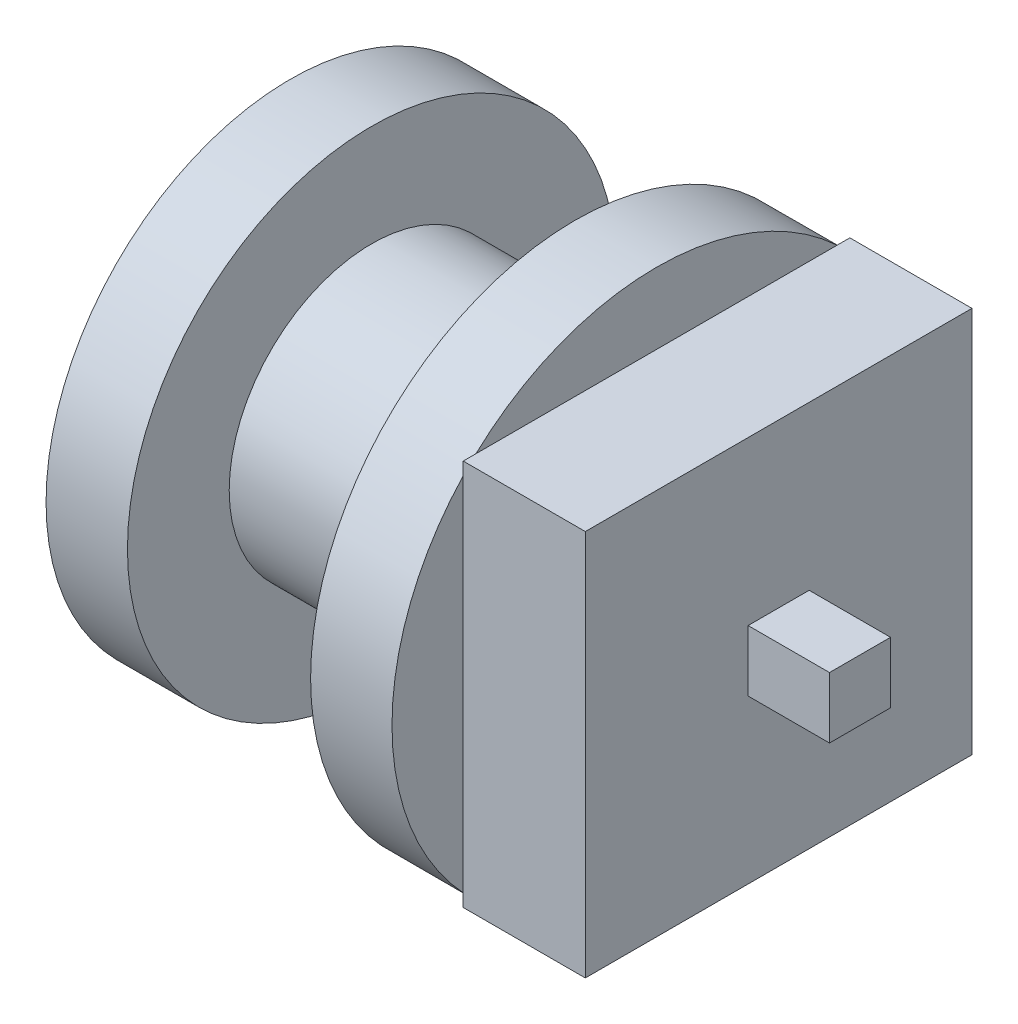
ISO-10303-21;
HEADER;
FILE_DESCRIPTION(('STEP AP214'),'2;1');
FILE_NAME('part.step','',(''),(''),'','','');
FILE_SCHEMA(('AUTOMOTIVE_DESIGN { 1 0 10303 214 1 1 1 1 }'));
ENDSEC;
DATA;
#1=APPLICATION_CONTEXT('core data for automotive mechanical design processes');
#2=APPLICATION_PROTOCOL_DEFINITION('international standard','automotive_design',2000,#1);
#3=PRODUCT_CONTEXT('',#1,'mechanical');
#4=PRODUCT('Part','Part','',(#3));
#5=PRODUCT_RELATED_PRODUCT_CATEGORY('part','',(#4));
#6=PRODUCT_DEFINITION_FORMATION('','',#4);
#7=PRODUCT_DEFINITION_CONTEXT('part definition',#1,'design');
#8=PRODUCT_DEFINITION('design','',#6,#7);
#9=PRODUCT_DEFINITION_SHAPE('','',#8);
#10=(LENGTH_UNIT() NAMED_UNIT(*) SI_UNIT(.MILLI.,.METRE.));
#11=(NAMED_UNIT(*) PLANE_ANGLE_UNIT() SI_UNIT($,.RADIAN.));
#12=(NAMED_UNIT(*) SI_UNIT($,.STERADIAN.) SOLID_ANGLE_UNIT());
#13=UNCERTAINTY_MEASURE_WITH_UNIT(LENGTH_MEASURE(1.E-05),#10,'distance_accuracy_value','');
#14=(GEOMETRIC_REPRESENTATION_CONTEXT(3) GLOBAL_UNCERTAINTY_ASSIGNED_CONTEXT((#13)) GLOBAL_UNIT_ASSIGNED_CONTEXT((#10,
#11,#12)) REPRESENTATION_CONTEXT('',''));
#15=CARTESIAN_POINT('',(0.,0.,0.));
#16=DIRECTION('',(0.,0.,1.));
#17=DIRECTION('',(1.,0.,0.));
#18=AXIS2_PLACEMENT_3D('',#15,#16,#17);
#19=CARTESIAN_POINT('',(-6.,0.,0.));
#20=DIRECTION('',(-1.,0.,0.));
#21=DIRECTION('',(0.,0.,1.));
#22=AXIS2_PLACEMENT_3D('',#19,#20,#21);
#23=PLANE('',#22);
#24=CARTESIAN_POINT('',(-6.,0.,0.));
#25=DIRECTION('',(-1.,0.,0.));
#26=DIRECTION('',(0.,0.,1.));
#27=AXIS2_PLACEMENT_3D('',#24,#25,#26);
#28=CIRCLE('',#27,13.);
#29=CARTESIAN_POINT('',(-6.,8.87411967464943,9.5));
#30=VERTEX_POINT('',#29);
#31=CARTESIAN_POINT('',(-6.,9.5,8.87411967464943));
#32=VERTEX_POINT('',#31);
#33=EDGE_CURVE('E157',#30,#32,#28,.T.);
#34=ORIENTED_EDGE('',*,*,#33,.F.);
#35=DIRECTION('',(0.,1.,0.));
#36=VECTOR('',#35,1.);
#37=CARTESIAN_POINT('',(-6.,9.5,9.5));
#38=LINE('',#37,#36);
#39=CARTESIAN_POINT('',(-6.,9.5,9.5));
#40=VERTEX_POINT('',#39);
#41=EDGE_CURVE('E141',#30,#40,#38,.T.);
#42=ORIENTED_EDGE('',*,*,#41,.T.);
#43=DIRECTION('',(0.,0.,-1.));
#44=VECTOR('',#43,1.);
#45=CARTESIAN_POINT('',(-6.,9.5,-9.5));
#46=LINE('',#45,#44);
#47=EDGE_CURVE('E192',#40,#32,#46,.T.);
#48=ORIENTED_EDGE('',*,*,#47,.T.);
#49=EDGE_LOOP('',(#34,#42,#48));
#50=FACE_BOUND('',#49,.T.);
#51=ADVANCED_FACE('F41',(#50),#23,.T.);
#52=CARTESIAN_POINT('',(-6.,9.5,-8.87411967464943));
#53=VERTEX_POINT('',#52);
#54=CARTESIAN_POINT('',(-6.,8.87411967464942,-9.5));
#55=VERTEX_POINT('',#54);
#56=EDGE_CURVE('E50',#53,#55,#28,.T.);
#57=ORIENTED_EDGE('',*,*,#56,.F.);
#58=CARTESIAN_POINT('',(-6.,9.5,-9.5));
#59=VERTEX_POINT('',#58);
#60=EDGE_CURVE('E138',#53,#59,#46,.T.);
#61=ORIENTED_EDGE('',*,*,#60,.T.);
#62=DIRECTION('',(0.,-1.,0.));
#63=VECTOR('',#62,1.);
#64=CARTESIAN_POINT('',(-6.,9.5,-9.5));
#65=LINE('',#64,#63);
#66=EDGE_CURVE('E182',#59,#55,#65,.T.);
#67=ORIENTED_EDGE('',*,*,#66,.T.);
#68=EDGE_LOOP('',(#57,#61,#67));
#69=FACE_BOUND('',#68,.T.);
#70=ADVANCED_FACE('F179',(#69),#23,.T.);
#71=CARTESIAN_POINT('',(-6.,-8.87411967464943,-9.5));
#72=VERTEX_POINT('',#71);
#73=CARTESIAN_POINT('',(-6.,-9.5,-8.87411967464942));
#74=VERTEX_POINT('',#73);
#75=EDGE_CURVE('E162',#72,#74,#28,.T.);
#76=ORIENTED_EDGE('',*,*,#75,.F.);
#77=CARTESIAN_POINT('',(-6.,-9.5,-9.5));
#78=VERTEX_POINT('',#77);
#79=EDGE_CURVE('E195',#72,#78,#65,.T.);
#80=ORIENTED_EDGE('',*,*,#79,.T.);
#81=DIRECTION('',(0.,0.,1.));
#82=VECTOR('',#81,1.);
#83=CARTESIAN_POINT('',(-6.,-9.5,-9.5));
#84=LINE('',#83,#82);
#85=EDGE_CURVE('E199',#78,#74,#84,.T.);
#86=ORIENTED_EDGE('',*,*,#85,.T.);
#87=EDGE_LOOP('',(#76,#80,#86));
#88=FACE_BOUND('',#87,.T.);
#89=ADVANCED_FACE('F279',(#88),#23,.T.);
#90=CARTESIAN_POINT('',(4.,1.5,-1.5));
#91=DIRECTION('',(0.,0.,1.));
#92=DIRECTION('',(0.,-1.,0.));
#93=AXIS2_PLACEMENT_3D('',#90,#91,#92);
#94=PLANE('',#93);
#95=DIRECTION('',(0.,1.,0.));
#96=VECTOR('',#95,1.);
#97=CARTESIAN_POINT('',(0.,1.5,-1.5));
#98=LINE('',#97,#96);
#99=CARTESIAN_POINT('',(0.,-1.5,-1.5));
#100=VERTEX_POINT('',#99);
#101=CARTESIAN_POINT('',(0.,1.5,-1.5));
#102=VERTEX_POINT('',#101);
#103=EDGE_CURVE('E217',#100,#102,#98,.T.);
#104=ORIENTED_EDGE('',*,*,#103,.T.);
#105=DIRECTION('',(-1.,0.,0.));
#106=VECTOR('',#105,1.);
#107=CARTESIAN_POINT('',(4.,1.5,-1.5));
#108=LINE('',#107,#106);
#109=CARTESIAN_POINT('',(4.,1.5,-1.5));
#110=VERTEX_POINT('',#109);
#111=EDGE_CURVE('E45',#110,#102,#108,.T.);
#112=ORIENTED_EDGE('',*,*,#111,.F.);
#113=DIRECTION('',(0.,1.,0.));
#114=VECTOR('',#113,1.);
#115=CARTESIAN_POINT('',(4.,1.5,-1.5));
#116=LINE('',#115,#114);
#117=CARTESIAN_POINT('',(4.,-1.5,-1.5));
#118=VERTEX_POINT('',#117);
#119=EDGE_CURVE('E218',#118,#110,#116,.T.);
#120=ORIENTED_EDGE('',*,*,#119,.F.);
#121=DIRECTION('',(-1.,0.,0.));
#122=VECTOR('',#121,1.);
#123=CARTESIAN_POINT('',(4.,-1.5,-1.5));
#124=LINE('',#123,#122);
#125=EDGE_CURVE('E228',#118,#100,#124,.T.);
#126=ORIENTED_EDGE('',*,*,#125,.T.);
#127=EDGE_LOOP('',(#104,#112,#120,#126));
#128=FACE_BOUND('',#127,.T.);
#129=ADVANCED_FACE('F43',(#128),#94,.F.);
#130=CARTESIAN_POINT('',(4.,1.5,1.5));
#131=DIRECTION('',(0.,-1.,0.));
#132=DIRECTION('',(0.,0.,-1.));
#133=AXIS2_PLACEMENT_3D('',#130,#131,#132);
#134=PLANE('',#133);
#135=DIRECTION('',(0.,0.,1.));
#136=VECTOR('',#135,1.);
#137=CARTESIAN_POINT('',(0.,1.5,1.5));
#138=LINE('',#137,#136);
#139=CARTESIAN_POINT('',(0.,1.5,1.5));
#140=VERTEX_POINT('',#139);
#141=EDGE_CURVE('E231',#102,#140,#138,.T.);
#142=ORIENTED_EDGE('',*,*,#141,.T.);
#143=DIRECTION('',(-1.,0.,0.));
#144=VECTOR('',#143,1.);
#145=CARTESIAN_POINT('',(4.,1.5,1.5));
#146=LINE('',#145,#144);
#147=CARTESIAN_POINT('',(4.,1.5,1.5));
#148=VERTEX_POINT('',#147);
#149=EDGE_CURVE('E164',#148,#140,#146,.T.);
#150=ORIENTED_EDGE('',*,*,#149,.F.);
#151=DIRECTION('',(0.,0.,1.));
#152=VECTOR('',#151,1.);
#153=CARTESIAN_POINT('',(4.,1.5,1.5));
#154=LINE('',#153,#152);
#155=EDGE_CURVE('E221',#110,#148,#154,.T.);
#156=ORIENTED_EDGE('',*,*,#155,.F.);
#157=ORIENTED_EDGE('',*,*,#111,.T.);
#158=EDGE_LOOP('',(#142,#150,#156,#157));
#159=FACE_BOUND('',#158,.T.);
#160=ADVANCED_FACE('F250',(#159),#134,.F.);
#161=CARTESIAN_POINT('',(4.,1.5,1.5));
#162=DIRECTION('',(0.,0.,-1.));
#163=DIRECTION('',(0.,1.,0.));
#164=AXIS2_PLACEMENT_3D('',#161,#162,#163);
#165=PLANE('',#164);
#166=DIRECTION('',(0.,-1.,0.));
#167=VECTOR('',#166,1.);
#168=CARTESIAN_POINT('',(0.,1.5,1.5));
#169=LINE('',#168,#167);
#170=CARTESIAN_POINT('',(0.,-1.5,1.5));
#171=VERTEX_POINT('',#170);
#172=EDGE_CURVE('E234',#140,#171,#169,.T.);
#173=ORIENTED_EDGE('',*,*,#172,.T.);
#174=DIRECTION('',(-1.,0.,0.));
#175=VECTOR('',#174,1.);
#176=CARTESIAN_POINT('',(4.,-1.5,1.5));
#177=LINE('',#176,#175);
#178=CARTESIAN_POINT('',(4.,-1.5,1.5));
#179=VERTEX_POINT('',#178);
#180=EDGE_CURVE('E241',#179,#171,#177,.T.);
#181=ORIENTED_EDGE('',*,*,#180,.F.);
#182=DIRECTION('',(0.,-1.,0.));
#183=VECTOR('',#182,1.);
#184=CARTESIAN_POINT('',(4.,1.5,1.5));
#185=LINE('',#184,#183);
#186=EDGE_CURVE('E224',#148,#179,#185,.T.);
#187=ORIENTED_EDGE('',*,*,#186,.F.);
#188=ORIENTED_EDGE('',*,*,#149,.T.);
#189=EDGE_LOOP('',(#173,#181,#187,#188));
#190=FACE_BOUND('',#189,.T.);
#191=ADVANCED_FACE('F247',(#190),#165,.F.);
#192=CARTESIAN_POINT('',(4.,-1.5,1.5));
#193=DIRECTION('',(0.,1.,0.));
#194=DIRECTION('',(0.,0.,1.));
#195=AXIS2_PLACEMENT_3D('',#192,#193,#194);
#196=PLANE('',#195);
#197=DIRECTION('',(0.,0.,-1.));
#198=VECTOR('',#197,1.);
#199=CARTESIAN_POINT('',(0.,-1.5,1.5));
#200=LINE('',#199,#198);
#201=EDGE_CURVE('E222',#171,#100,#200,.T.);
#202=ORIENTED_EDGE('',*,*,#201,.T.);
#203=ORIENTED_EDGE('',*,*,#125,.F.);
#204=DIRECTION('',(0.,0.,-1.));
#205=VECTOR('',#204,1.);
#206=CARTESIAN_POINT('',(4.,-1.5,1.5));
#207=LINE('',#206,#205);
#208=EDGE_CURVE('E226',#179,#118,#207,.T.);
#209=ORIENTED_EDGE('',*,*,#208,.F.);
#210=ORIENTED_EDGE('',*,*,#180,.T.);
#211=EDGE_LOOP('',(#202,#203,#209,#210));
#212=FACE_BOUND('',#211,.T.);
#213=ADVANCED_FACE('F257',(#212),#196,.F.);
#214=CARTESIAN_POINT('',(4.,0.,0.));
#215=DIRECTION('',(1.,0.,0.));
#216=DIRECTION('',(0.,0.,-1.));
#217=AXIS2_PLACEMENT_3D('',#214,#215,#216);
#218=PLANE('',#217);
#219=ORIENTED_EDGE('',*,*,#119,.T.);
#220=ORIENTED_EDGE('',*,*,#155,.T.);
#221=ORIENTED_EDGE('',*,*,#186,.T.);
#222=ORIENTED_EDGE('',*,*,#208,.T.);
#223=EDGE_LOOP('',(#219,#220,#221,#222));
#224=FACE_BOUND('',#223,.T.);
#225=ADVANCED_FACE('F262',(#224),#218,.T.);
#226=CARTESIAN_POINT('',(-6.,9.5,9.5));
#227=DIRECTION('',(0.,0.,-1.));
#228=DIRECTION('',(0.,1.,0.));
#229=AXIS2_PLACEMENT_3D('',#226,#227,#228);
#230=PLANE('',#229);
#231=DIRECTION('',(0.,1.,0.));
#232=VECTOR('',#231,1.);
#233=CARTESIAN_POINT('',(0.,9.5,9.5));
#234=LINE('',#233,#232);
#235=CARTESIAN_POINT('',(0.,-9.5,9.5));
#236=VERTEX_POINT('',#235);
#237=CARTESIAN_POINT('',(0.,9.5,9.5));
#238=VERTEX_POINT('',#237);
#239=EDGE_CURVE('E170',#236,#238,#234,.T.);
#240=ORIENTED_EDGE('',*,*,#239,.T.);
#241=DIRECTION('',(1.,0.,0.));
#242=VECTOR('',#241,1.);
#243=CARTESIAN_POINT('',(-6.,9.5,9.5));
#244=LINE('',#243,#242);
#245=EDGE_CURVE('E214',#40,#238,#244,.T.);
#246=ORIENTED_EDGE('',*,*,#245,.F.);
#247=ORIENTED_EDGE('',*,*,#41,.F.);
#248=CARTESIAN_POINT('',(-6.,-8.87411967464943,9.5));
#249=VERTEX_POINT('',#248);
#250=EDGE_CURVE('E139',#249,#30,#38,.T.);
#251=ORIENTED_EDGE('',*,*,#250,.F.);
#252=CARTESIAN_POINT('',(-6.,-9.5,9.5));
#253=VERTEX_POINT('',#252);
#254=EDGE_CURVE('E131',#253,#249,#38,.T.);
#255=ORIENTED_EDGE('',*,*,#254,.F.);
#256=DIRECTION('',(1.,0.,0.));
#257=VECTOR('',#256,1.);
#258=CARTESIAN_POINT('',(-6.,-9.5,9.5));
#259=LINE('',#258,#257);
#260=EDGE_CURVE('E201',#253,#236,#259,.T.);
#261=ORIENTED_EDGE('',*,*,#260,.T.);
#262=EDGE_LOOP('',(#240,#246,#247,#251,#255,#261));
#263=FACE_BOUND('',#262,.T.);
#264=ADVANCED_FACE('F146',(#263),#230,.F.);
#265=CARTESIAN_POINT('',(-6.,9.5,-9.5));
#266=DIRECTION('',(0.,-1.,0.));
#267=DIRECTION('',(0.,0.,-1.));
#268=AXIS2_PLACEMENT_3D('',#265,#266,#267);
#269=PLANE('',#268);
#270=DIRECTION('',(0.,0.,-1.));
#271=VECTOR('',#270,1.);
#272=CARTESIAN_POINT('',(0.,9.5,-9.5));
#273=LINE('',#272,#271);
#274=CARTESIAN_POINT('',(0.,9.5,-9.5));
#275=VERTEX_POINT('',#274);
#276=EDGE_CURVE('E203',#238,#275,#273,.T.);
#277=ORIENTED_EDGE('',*,*,#276,.T.);
#278=DIRECTION('',(1.,0.,0.));
#279=VECTOR('',#278,1.);
#280=CARTESIAN_POINT('',(-6.,9.5,-9.5));
#281=LINE('',#280,#279);
#282=EDGE_CURVE('E190',#59,#275,#281,.T.);
#283=ORIENTED_EDGE('',*,*,#282,.F.);
#284=ORIENTED_EDGE('',*,*,#60,.F.);
#285=EDGE_CURVE('E187',#32,#53,#46,.T.);
#286=ORIENTED_EDGE('',*,*,#285,.F.);
#287=ORIENTED_EDGE('',*,*,#47,.F.);
#288=ORIENTED_EDGE('',*,*,#245,.T.);
#289=EDGE_LOOP('',(#277,#283,#284,#286,#287,#288));
#290=FACE_BOUND('',#289,.T.);
#291=ADVANCED_FACE('F185',(#290),#269,.F.);
#292=CARTESIAN_POINT('',(-6.,9.5,-9.5));
#293=DIRECTION('',(0.,0.,1.));
#294=DIRECTION('',(0.,-1.,0.));
#295=AXIS2_PLACEMENT_3D('',#292,#293,#294);
#296=PLANE('',#295);
#297=DIRECTION('',(0.,-1.,0.));
#298=VECTOR('',#297,1.);
#299=CARTESIAN_POINT('',(0.,9.5,-9.5));
#300=LINE('',#299,#298);
#301=CARTESIAN_POINT('',(0.,-9.5,-9.5));
#302=VERTEX_POINT('',#301);
#303=EDGE_CURVE('E205',#275,#302,#300,.T.);
#304=ORIENTED_EDGE('',*,*,#303,.T.);
#305=DIRECTION('',(1.,0.,0.));
#306=VECTOR('',#305,1.);
#307=CARTESIAN_POINT('',(-6.,-9.5,-9.5));
#308=LINE('',#307,#306);
#309=EDGE_CURVE('E210',#78,#302,#308,.T.);
#310=ORIENTED_EDGE('',*,*,#309,.F.);
#311=ORIENTED_EDGE('',*,*,#79,.F.);
#312=EDGE_CURVE('E198',#55,#72,#65,.T.);
#313=ORIENTED_EDGE('',*,*,#312,.F.);
#314=ORIENTED_EDGE('',*,*,#66,.F.);
#315=ORIENTED_EDGE('',*,*,#282,.T.);
#316=EDGE_LOOP('',(#304,#310,#311,#313,#314,#315));
#317=FACE_BOUND('',#316,.T.);
#318=ADVANCED_FACE('F288',(#317),#296,.F.);
#319=CARTESIAN_POINT('',(-6.,-9.5,-9.5));
#320=DIRECTION('',(0.,1.,0.));
#321=DIRECTION('',(0.,0.,1.));
#322=AXIS2_PLACEMENT_3D('',#319,#320,#321);
#323=PLANE('',#322);
#324=DIRECTION('',(0.,0.,1.));
#325=VECTOR('',#324,1.);
#326=CARTESIAN_POINT('',(0.,-9.5,-9.5));
#327=LINE('',#326,#325);
#328=EDGE_CURVE('E207',#302,#236,#327,.T.);
#329=ORIENTED_EDGE('',*,*,#328,.T.);
#330=ORIENTED_EDGE('',*,*,#260,.F.);
#331=CARTESIAN_POINT('',(-6.,-9.5,8.87411967464942));
#332=VERTEX_POINT('',#331);
#333=EDGE_CURVE('E134',#332,#253,#84,.T.);
#334=ORIENTED_EDGE('',*,*,#333,.F.);
#335=EDGE_CURVE('E65',#74,#332,#84,.T.);
#336=ORIENTED_EDGE('',*,*,#335,.F.);
#337=ORIENTED_EDGE('',*,*,#85,.F.);
#338=ORIENTED_EDGE('',*,*,#309,.T.);
#339=EDGE_LOOP('',(#329,#330,#334,#336,#337,#338));
#340=FACE_BOUND('',#339,.T.);
#341=ADVANCED_FACE('F283',(#340),#323,.F.);
#342=EDGE_CURVE('E58',#332,#249,#28,.T.);
#343=ORIENTED_EDGE('',*,*,#342,.F.);
#344=ORIENTED_EDGE('',*,*,#333,.T.);
#345=ORIENTED_EDGE('',*,*,#254,.T.);
#346=EDGE_LOOP('',(#343,#344,#345));
#347=FACE_BOUND('',#346,.T.);
#348=ADVANCED_FACE('F133',(#347),#23,.T.);
#349=CARTESIAN_POINT('',(0.,0.,0.));
#350=DIRECTION('',(-1.,0.,0.));
#351=DIRECTION('',(0.,0.,1.));
#352=AXIS2_PLACEMENT_3D('',#349,#350,#351);
#353=PLANE('',#352);
#354=ORIENTED_EDGE('',*,*,#103,.F.);
#355=ORIENTED_EDGE('',*,*,#201,.F.);
#356=ORIENTED_EDGE('',*,*,#172,.F.);
#357=ORIENTED_EDGE('',*,*,#141,.F.);
#358=EDGE_LOOP('',(#354,#355,#356,#357));
#359=FACE_BOUND('',#358,.T.);
#360=ORIENTED_EDGE('',*,*,#239,.F.);
#361=ORIENTED_EDGE('',*,*,#328,.F.);
#362=ORIENTED_EDGE('',*,*,#303,.F.);
#363=ORIENTED_EDGE('',*,*,#276,.F.);
#364=EDGE_LOOP('',(#360,#361,#362,#363));
#365=FACE_BOUND('',#364,.T.);
#366=ADVANCED_FACE('F253',(#359,#365),#353,.F.);
#367=CARTESIAN_POINT('',(-6.,0.,0.));
#368=DIRECTION('',(-1.,0.,0.));
#369=DIRECTION('',(0.,0.,1.));
#370=AXIS2_PLACEMENT_3D('',#367,#368,#369);
#371=PLANE('',#370);
#372=EDGE_CURVE('E150',#249,#30,#28,.T.);
#373=ORIENTED_EDGE('',*,*,#372,.F.);
#374=ORIENTED_EDGE('',*,*,#250,.T.);
#375=EDGE_LOOP('',(#373,#374));
#376=FACE_BOUND('',#375,.T.);
#377=ADVANCED_FACE('F151',(#376),#371,.F.);
#378=EDGE_CURVE('E167',#32,#53,#28,.T.);
#379=ORIENTED_EDGE('',*,*,#378,.F.);
#380=ORIENTED_EDGE('',*,*,#285,.T.);
#381=EDGE_LOOP('',(#379,#380));
#382=FACE_BOUND('',#381,.T.);
#383=ADVANCED_FACE('F194',(#382),#371,.F.);
#384=EDGE_CURVE('E171',#55,#72,#28,.T.);
#385=ORIENTED_EDGE('',*,*,#384,.F.);
#386=ORIENTED_EDGE('',*,*,#312,.T.);
#387=EDGE_LOOP('',(#385,#386));
#388=FACE_BOUND('',#387,.T.);
#389=ADVANCED_FACE('F299',(#388),#371,.F.);
#390=EDGE_CURVE('E154',#74,#332,#28,.T.);
#391=ORIENTED_EDGE('',*,*,#390,.F.);
#392=ORIENTED_EDGE('',*,*,#335,.T.);
#393=EDGE_LOOP('',(#391,#392));
#394=FACE_BOUND('',#393,.T.);
#395=ADVANCED_FACE('F301',(#394),#371,.F.);
#396=CARTESIAN_POINT('',(-10.,0.,0.));
#397=DIRECTION('',(1.,0.,0.));
#398=DIRECTION('',(0.,0.,-1.));
#399=AXIS2_PLACEMENT_3D('',#396,#397,#398);
#400=CYLINDRICAL_SURFACE('',#399,13.);
#401=CARTESIAN_POINT('',(-10.,0.,0.));
#402=DIRECTION('',(-1.,0.,0.));
#403=DIRECTION('',(0.,0.,1.));
#404=AXIS2_PLACEMENT_3D('',#401,#402,#403);
#405=CIRCLE('',#404,13.);
#406=CARTESIAN_POINT('',(-10.,0.,13.));
#407=VERTEX_POINT('',#406);
#408=EDGE_CURVE('E166',#407,#407,#405,.T.);
#409=ORIENTED_EDGE('',*,*,#408,.F.);
#410=EDGE_LOOP('',(#409));
#411=FACE_BOUND('',#410,.T.);
#412=ORIENTED_EDGE('',*,*,#33,.T.);
#413=ORIENTED_EDGE('',*,*,#378,.T.);
#414=ORIENTED_EDGE('',*,*,#56,.T.);
#415=ORIENTED_EDGE('',*,*,#384,.T.);
#416=ORIENTED_EDGE('',*,*,#75,.T.);
#417=ORIENTED_EDGE('',*,*,#390,.T.);
#418=ORIENTED_EDGE('',*,*,#342,.T.);
#419=ORIENTED_EDGE('',*,*,#372,.T.);
#420=EDGE_LOOP('',(#412,#413,#414,#415,#416,#417,#418,#419));
#421=FACE_BOUND('',#420,.T.);
#422=ADVANCED_FACE('F159',(#411,#421),#400,.T.);
#423=CARTESIAN_POINT('',(-10.,0.,0.));
#424=DIRECTION('',(-1.,0.,0.));
#425=DIRECTION('',(0.,0.,1.));
#426=AXIS2_PLACEMENT_3D('',#423,#424,#425);
#427=PLANE('',#426);
#428=CARTESIAN_POINT('',(-10.,0.,0.));
#429=DIRECTION('',(-1.,0.,0.));
#430=DIRECTION('',(0.,0.,1.));
#431=AXIS2_PLACEMENT_3D('',#428,#429,#430);
#432=CIRCLE('',#431,7.);
#433=CARTESIAN_POINT('',(-10.,0.,7.));
#434=VERTEX_POINT('',#433);
#435=EDGE_CURVE('E11',#434,#434,#432,.T.);
#436=ORIENTED_EDGE('',*,*,#435,.F.);
#437=EDGE_LOOP('',(#436));
#438=FACE_BOUND('',#437,.T.);
#439=ORIENTED_EDGE('',*,*,#408,.T.);
#440=EDGE_LOOP('',(#439));
#441=FACE_BOUND('',#440,.T.);
#442=ADVANCED_FACE('F309',(#438,#441),#427,.T.);
#443=CARTESIAN_POINT('',(-20.,0.,0.));
#444=DIRECTION('',(1.,0.,0.));
#445=DIRECTION('',(0.,0.,-1.));
#446=AXIS2_PLACEMENT_3D('',#443,#444,#445);
#447=CYLINDRICAL_SURFACE('',#446,7.);
#448=CARTESIAN_POINT('',(-20.,0.,0.));
#449=DIRECTION('',(-1.,0.,0.));
#450=DIRECTION('',(0.,0.,1.));
#451=AXIS2_PLACEMENT_3D('',#448,#449,#450);
#452=CIRCLE('',#451,7.);
#453=CARTESIAN_POINT('',(-20.,0.,7.));
#454=VERTEX_POINT('',#453);
#455=EDGE_CURVE('E155',#454,#454,#452,.T.);
#456=ORIENTED_EDGE('',*,*,#455,.F.);
#457=EDGE_LOOP('',(#456));
#458=FACE_BOUND('',#457,.T.);
#459=ORIENTED_EDGE('',*,*,#435,.T.);
#460=EDGE_LOOP('',(#459));
#461=FACE_BOUND('',#460,.T.);
#462=ADVANCED_FACE('F316',(#458,#461),#447,.T.);
#463=CARTESIAN_POINT('',(-24.,0.,0.));
#464=DIRECTION('',(1.,0.,0.));
#465=DIRECTION('',(0.,0.,-1.));
#466=AXIS2_PLACEMENT_3D('',#463,#464,#465);
#467=CYLINDRICAL_SURFACE('',#466,12.);
#468=CARTESIAN_POINT('',(-24.,0.,0.));
#469=DIRECTION('',(-1.,0.,0.));
#470=DIRECTION('',(0.,0.,1.));
#471=AXIS2_PLACEMENT_3D('',#468,#469,#470);
#472=CIRCLE('',#471,12.);
#473=CARTESIAN_POINT('',(-24.,0.,12.));
#474=VERTEX_POINT('',#473);
#475=EDGE_CURVE('E358',#474,#474,#472,.T.);
#476=ORIENTED_EDGE('',*,*,#475,.F.);
#477=EDGE_LOOP('',(#476));
#478=FACE_BOUND('',#477,.T.);
#479=CARTESIAN_POINT('',(-20.,0.,0.));
#480=DIRECTION('',(-1.,0.,0.));
#481=DIRECTION('',(0.,0.,1.));
#482=AXIS2_PLACEMENT_3D('',#479,#480,#481);
#483=CIRCLE('',#482,12.);
#484=CARTESIAN_POINT('',(-20.,0.,12.));
#485=VERTEX_POINT('',#484);
#486=EDGE_CURVE('E354',#485,#485,#483,.T.);
#487=ORIENTED_EDGE('',*,*,#486,.T.);
#488=EDGE_LOOP('',(#487));
#489=FACE_BOUND('',#488,.T.);
#490=ADVANCED_FACE('F323',(#478,#489),#467,.T.);
#491=CARTESIAN_POINT('',(-24.,0.,0.));
#492=DIRECTION('',(-1.,0.,0.));
#493=DIRECTION('',(0.,0.,1.));
#494=AXIS2_PLACEMENT_3D('',#491,#492,#493);
#495=PLANE('',#494);
#496=CARTESIAN_POINT('',(-24.,0.,0.));
#497=DIRECTION('',(-1.,0.,0.));
#498=DIRECTION('',(0.,0.,1.));
#499=AXIS2_PLACEMENT_3D('',#496,#497,#498);
#500=CIRCLE('',#499,5.);
#501=CARTESIAN_POINT('',(-24.,0.,5.));
#502=VERTEX_POINT('',#501);
#503=EDGE_CURVE('E355',#502,#502,#500,.T.);
#504=ORIENTED_EDGE('',*,*,#503,.F.);
#505=EDGE_LOOP('',(#504));
#506=FACE_BOUND('',#505,.T.);
#507=ORIENTED_EDGE('',*,*,#475,.T.);
#508=EDGE_LOOP('',(#507));
#509=FACE_BOUND('',#508,.T.);
#510=ADVANCED_FACE('F330',(#506,#509),#495,.T.);
#511=CARTESIAN_POINT('',(-20.,0.,0.));
#512=DIRECTION('',(-1.,0.,0.));
#513=DIRECTION('',(0.,0.,1.));
#514=AXIS2_PLACEMENT_3D('',#511,#512,#513);
#515=PLANE('',#514);
#516=ORIENTED_EDGE('',*,*,#455,.T.);
#517=EDGE_LOOP('',(#516));
#518=FACE_BOUND('',#517,.T.);
#519=ORIENTED_EDGE('',*,*,#486,.F.);
#520=EDGE_LOOP('',(#519));
#521=FACE_BOUND('',#520,.T.);
#522=ADVANCED_FACE('F335',(#518,#521),#515,.F.);
#523=CARTESIAN_POINT('',(-18.,0.,0.));
#524=DIRECTION('',(-1.,0.,0.));
#525=DIRECTION('',(0.,0.,1.));
#526=AXIS2_PLACEMENT_3D('',#523,#524,#525);
#527=CYLINDRICAL_SURFACE('',#526,5.);
#528=CARTESIAN_POINT('',(-18.,0.,0.));
#529=DIRECTION('',(-1.,0.,0.));
#530=DIRECTION('',(0.,0.,1.));
#531=AXIS2_PLACEMENT_3D('',#528,#529,#530);
#532=CIRCLE('',#531,5.);
#533=CARTESIAN_POINT('',(-18.,0.,5.));
#534=VERTEX_POINT('',#533);
#535=EDGE_CURVE('E353',#534,#534,#532,.T.);
#536=ORIENTED_EDGE('',*,*,#535,.F.);
#537=EDGE_LOOP('',(#536));
#538=FACE_BOUND('',#537,.T.);
#539=ORIENTED_EDGE('',*,*,#503,.T.);
#540=EDGE_LOOP('',(#539));
#541=FACE_BOUND('',#540,.T.);
#542=ADVANCED_FACE('F338',(#538,#541),#527,.F.);
#543=CARTESIAN_POINT('',(-18.,0.,0.));
#544=DIRECTION('',(-1.,0.,0.));
#545=DIRECTION('',(0.,0.,1.));
#546=AXIS2_PLACEMENT_3D('',#543,#544,#545);
#547=PLANE('',#546);
#548=ORIENTED_EDGE('',*,*,#535,.T.);
#549=EDGE_LOOP('',(#548));
#550=FACE_BOUND('',#549,.T.);
#551=ADVANCED_FACE('F345',(#550),#547,.T.);
#552=CLOSED_SHELL('',(#51,#70,#89,#129,#160,#191,#213,#225,#264,#291,#318,#341,#348,#366,#377,
#383,#389,#395,#422,#442,#462,#490,#510,#522,#542,#551));
#553=MANIFOLD_SOLID_BREP('B2',#552);
#554=ADVANCED_BREP_SHAPE_REPRESENTATION('',(#18,#553),#14);
#555=SHAPE_DEFINITION_REPRESENTATION(#9,#554);
ENDSEC;
END-ISO-10303-21;
